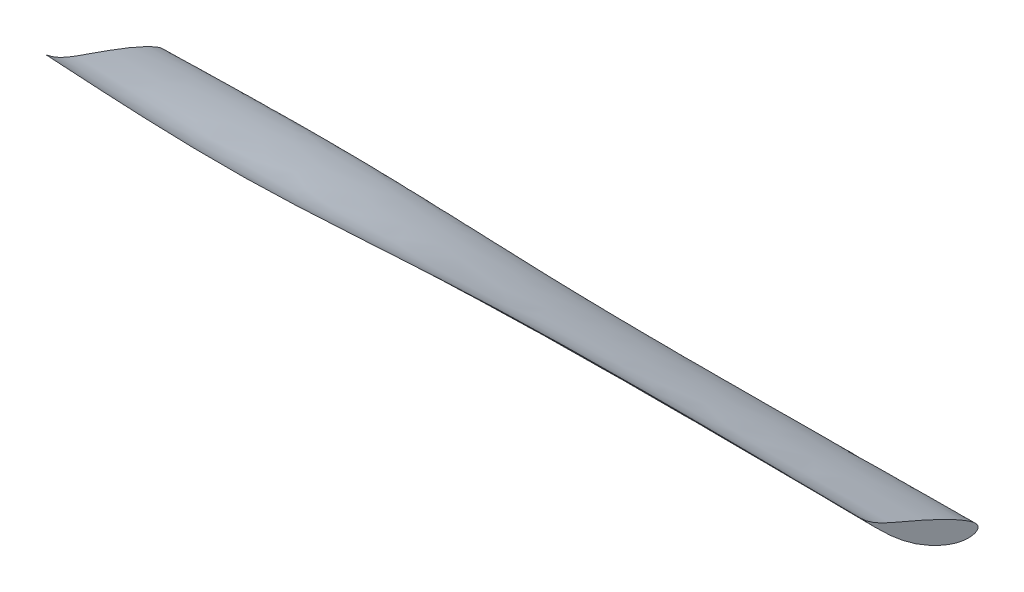
ISO-10303-21;
HEADER;
FILE_DESCRIPTION(('STEP AP214'),'2;1');
FILE_NAME('part.step','',(''),(''),'','','');
FILE_SCHEMA(('AUTOMOTIVE_DESIGN { 1 0 10303 214 1 1 1 1 }'));
ENDSEC;
DATA;
#1=APPLICATION_CONTEXT('core data for automotive mechanical design processes');
#2=APPLICATION_PROTOCOL_DEFINITION('international standard','automotive_design',2000,#1);
#3=PRODUCT_CONTEXT('',#1,'mechanical');
#4=PRODUCT('Part','Part','',(#3));
#5=PRODUCT_RELATED_PRODUCT_CATEGORY('part','',(#4));
#6=PRODUCT_DEFINITION_FORMATION('','',#4);
#7=PRODUCT_DEFINITION_CONTEXT('part definition',#1,'design');
#8=PRODUCT_DEFINITION('design','',#6,#7);
#9=PRODUCT_DEFINITION_SHAPE('','',#8);
#10=(LENGTH_UNIT() NAMED_UNIT(*) SI_UNIT(.MILLI.,.METRE.));
#11=(NAMED_UNIT(*) PLANE_ANGLE_UNIT() SI_UNIT($,.RADIAN.));
#12=(NAMED_UNIT(*) SI_UNIT($,.STERADIAN.) SOLID_ANGLE_UNIT());
#13=UNCERTAINTY_MEASURE_WITH_UNIT(LENGTH_MEASURE(1.E-05),#10,'distance_accuracy_value','');
#14=(GEOMETRIC_REPRESENTATION_CONTEXT(3) GLOBAL_UNCERTAINTY_ASSIGNED_CONTEXT((#13)) GLOBAL_UNIT_ASSIGNED_CONTEXT((#10,
#11,#12)) REPRESENTATION_CONTEXT('',''));
#15=CARTESIAN_POINT('',(0.,0.,0.));
#16=DIRECTION('',(0.,0.,1.));
#17=DIRECTION('',(1.,0.,0.));
#18=AXIS2_PLACEMENT_3D('',#15,#16,#17);
#19=CARTESIAN_POINT('',(301.761653022197,23.5445932351853,31.5919798363942));
#20=DIRECTION('',(1.,0.,0.));
#21=DIRECTION('',(0.,0.,1.));
#22=AXIS2_PLACEMENT_3D('',#19,#20,#21);
#23=PLANE('',#22);
#24=CARTESIAN_POINT('',(301.761653022197,35.4339005781969,54.10357532692));
#25=CARTESIAN_POINT('',(301.761653022197,34.2381881895794,52.8955230255901));
#26=CARTESIAN_POINT('',(301.761653022197,32.1428343468748,50.2360352412443));
#27=CARTESIAN_POINT('',(301.761653022197,29.6938278537414,45.7981714533343));
#28=CARTESIAN_POINT('',(301.761653022197,27.6735843988713,41.1787572420392));
#29=CARTESIAN_POINT('',(301.761653022197,25.7176513120445,36.5225225253925));
#30=CARTESIAN_POINT('',(301.761653022197,23.695720292381,31.894572560708));
#31=CARTESIAN_POINT('',(301.761653022197,21.5984931931603,27.3081732984461));
#32=CARTESIAN_POINT('',(301.761653022197,19.4455955790061,22.7564956841988));
#33=CARTESIAN_POINT('',(301.761653022197,17.5082778691136,19.0387125988831));
#34=CARTESIAN_POINT('',(301.761653022197,15.8538747820841,16.1253914306171));
#35=CARTESIAN_POINT('',(301.761653022197,14.7486241627605,14.3447709325331));
#36=CARTESIAN_POINT('',(301.761653022197,13.798577758102,12.9569555017875));
#37=CARTESIAN_POINT('',(301.761653022197,13.0042141147821,11.9524705075148));
#38=CARTESIAN_POINT('',(301.761653022197,11.9509988926326,10.8600952656026));
#39=CARTESIAN_POINT('',(301.761653022197,10.9287179976586,10.3342016372565));
#40=CARTESIAN_POINT('',(301.761653022197,10.2024209056551,10.6788708378612));
#41=B_SPLINE_CURVE_WITH_KNOTS('',3,(#24,#25,#26,#27,#28,#29,#30,#31,#32,#33,#34,#35,#36,#37,#38,
#39,#40),.UNSPECIFIED.,.F.,.F.,(4,1,1,1,1,1,1,1,1,1,1,1,1,1,4),(0.,0.0994502667406111,
0.197535442889514,0.296052562977772,0.394806356808814,0.493450979662712,0.591940996969297,
0.690286731259081,0.788438582066012,0.837480949450307,0.886562535047494,0.911178481655704,
0.935996245563337,0.961487145328943,1.),.UNSPECIFIED.);
#42=CARTESIAN_POINT('',(301.761653022197,10.2024209056551,10.6788708378612));
#43=VERTEX_POINT('',#42);
#44=CARTESIAN_POINT('',(301.761653022197,35.4339005781969,54.10357532692));
#45=VERTEX_POINT('',#44);
#46=EDGE_CURVE('E40',#43,#45,#41,.F.);
#47=ORIENTED_EDGE('',*,*,#46,.T.);
#48=CARTESIAN_POINT('',(301.761653022197,10.2024209056551,10.6788708378612));
#49=CARTESIAN_POINT('',(301.761653022197,9.53216321875651,11.1904140364192));
#50=CARTESIAN_POINT('',(301.761653022197,9.14745858945485,12.4362131774804));
#51=CARTESIAN_POINT('',(301.761653022197,9.05729615795471,14.1752019618341));
#52=CARTESIAN_POINT('',(301.761653022197,9.15989810619456,15.5901834868764));
#53=CARTESIAN_POINT('',(301.761653022197,9.43036237564233,17.3559755452917));
#54=CARTESIAN_POINT('',(301.761653022197,9.96453582628308,19.4660487541451));
#55=CARTESIAN_POINT('',(301.761653022197,11.0827536415392,22.6853781510137));
#56=CARTESIAN_POINT('',(301.761653022197,12.8232789365591,26.5267046993073));
#57=CARTESIAN_POINT('',(301.761653022197,15.2532400414026,30.9385941988985));
#58=CARTESIAN_POINT('',(301.761653022197,17.9854624447831,35.1779101738743));
#59=CARTESIAN_POINT('',(301.761653022197,21.0567921584213,39.2152051247754));
#60=CARTESIAN_POINT('',(301.761653022197,24.3934392452951,43.0946377459128));
#61=CARTESIAN_POINT('',(301.761653022197,27.9556329108987,46.834343905403));
#62=CARTESIAN_POINT('',(301.761653022197,31.6525993706431,50.4968423811324));
#63=CARTESIAN_POINT('',(301.761653022197,34.1843384422545,52.8862952058577));
#64=CARTESIAN_POINT('',(301.761653022197,35.4339005781969,54.10357532692));
#65=B_SPLINE_CURVE_WITH_KNOTS('',3,(#48,#49,#50,#51,#52,#53,#54,#55,#56,#57,#58,#59,#60,#61,#62,
#63,#64),.UNSPECIFIED.,.F.,.F.,(4,1,1,1,1,1,1,1,1,1,1,1,1,1,4),(0.,0.0439009675766793,
0.0724931974140234,0.0990463982397024,0.124643035702787,0.174283288293371,0.222881713336981,
0.31883035285832,0.41429919096017,0.509891636581509,0.60612378963281,0.703302686626897,
0.801511361886123,0.900533646948853,1.),.UNSPECIFIED.);
#66=EDGE_CURVE('E69',#45,#43,#65,.F.);
#67=ORIENTED_EDGE('',*,*,#66,.T.);
#68=EDGE_LOOP('',(#47,#67));
#69=FACE_BOUND('',#68,.T.);
#70=ADVANCED_FACE('F37',(#69),#23,.T.);
#71=CARTESIAN_POINT('',(0.,23.484223991255,31.7011060039401));
#72=DIRECTION('',(1.,0.,0.));
#73=DIRECTION('',(0.,0.,1.));
#74=AXIS2_PLACEMENT_3D('',#71,#72,#73);
#75=PLANE('',#74);
#76=CARTESIAN_POINT('',(0.,33.4718637070637,54.3097643297301));
#77=CARTESIAN_POINT('',(0.,32.395776073136,53.0586742504488));
#78=CARTESIAN_POINT('',(0.,30.5468507342221,50.3408636441683));
#79=CARTESIAN_POINT('',(0.,28.476047650665,45.8767302196085));
#80=CARTESIAN_POINT('',(0.,26.8328108478623,41.2658512957863));
#81=CARTESIAN_POINT('',(0.,25.2543553945098,36.623674473178));
#82=CARTESIAN_POINT('',(0.,23.6100632017207,32.0044143131714));
#83=CARTESIAN_POINT('',(0.,21.8900292839443,27.4202880068344));
#84=CARTESIAN_POINT('',(0.,20.1137239707885,22.8660129390922));
#85=CARTESIAN_POINT('',(0.,18.4896405150433,19.13397699365));
#86=CARTESIAN_POINT('',(0.,17.084988176991,16.2002424969715));
#87=CARTESIAN_POINT('',(0.,16.1353498503008,14.4007637609852));
#88=CARTESIAN_POINT('',(0.,15.3093801529886,12.9922393722692));
#89=CARTESIAN_POINT('',(0.,14.6081852314093,11.9655257350319));
#90=CARTESIAN_POINT('',(0.,13.662257675184,10.8361332014463));
#91=CARTESIAN_POINT('',(0.,12.7078642109712,10.2574690494851));
#92=CARTESIAN_POINT('',(0.,11.9810754589233,10.542010721781));
#93=B_SPLINE_CURVE_WITH_KNOTS('',3,(#76,#77,#78,#79,#80,#81,#82,#83,#84,#85,#86,#87,#88,#89,#90,
#91,#92),.UNSPECIFIED.,.F.,.F.,(4,1,1,1,1,1,1,1,1,1,1,1,1,1,4),(0.,0.0994502667406111,
0.197535442889514,0.296052562977772,0.394806356808814,0.493450979662712,0.591940996969297,
0.690286731259081,0.788438582066012,0.837480949450307,0.886562535047494,0.911178481655704,
0.935996245563337,0.961487145328943,1.),.UNSPECIFIED.);
#94=CARTESIAN_POINT('',(0.,33.4718637070637,54.3097643297301));
#95=VERTEX_POINT('',#94);
#96=CARTESIAN_POINT('',(0.,11.9810754589233,10.542010721781));
#97=VERTEX_POINT('',#96);
#98=EDGE_CURVE('E11',#95,#97,#93,.T.);
#99=ORIENTED_EDGE('',*,*,#98,.T.);
#100=CARTESIAN_POINT('',(0.,11.9810754589233,10.542010721781));
#101=CARTESIAN_POINT('',(0.,11.297240795926,10.9919689316582));
#102=CARTESIAN_POINT('',(0.,10.8401547295533,12.1724139891022));
#103=CARTESIAN_POINT('',(0.,10.6348750572766,13.8504860760179));
#104=CARTESIAN_POINT('',(0.,10.6382631297944,15.2278368902834));
#105=CARTESIAN_POINT('',(0.,10.7804276026314,16.9563295140538));
#106=CARTESIAN_POINT('',(0.,11.1546378085893,19.0361417787975));
#107=CARTESIAN_POINT('',(0.,12.0192446516231,22.2298709050762));
#108=CARTESIAN_POINT('',(0.,13.4443570594694,26.0682083226455));
#109=CARTESIAN_POINT('',(0.,15.4984768125264,30.5058941070354));
#110=CARTESIAN_POINT('',(0.,17.8570386432198,34.796947575819));
#111=CARTESIAN_POINT('',(0.,20.5577249067278,38.9153485367814));
#112=CARTESIAN_POINT('',(0.,23.5260756529886,42.8988588139013));
#113=CARTESIAN_POINT('',(0.,26.7223431998189,46.76234503904));
#114=CARTESIAN_POINT('',(0.,30.0543735669652,50.5601984947121));
#115=CARTESIAN_POINT('',(0.,32.3442492337358,53.0460845084862));
#116=CARTESIAN_POINT('',(0.,33.4718637070637,54.3097643297301));
#117=B_SPLINE_CURVE_WITH_KNOTS('',3,(#100,#101,#102,#103,#104,#105,#106,#107,#108,#109,#110,
#111,#112,#113,#114,#115,#116),.UNSPECIFIED.,.F.,.F.,(4,1,1,1,1,1,1,1,1,1,1,1,1,1,4),(0.,
0.0439009675766793,0.0724931974140234,0.0990463982397024,0.124643035702787,0.174283288293371,
0.222881713336981,0.31883035285832,0.41429919096017,0.509891636581509,0.60612378963281,
0.703302686626897,0.801511361886123,0.900533646948853,1.),.UNSPECIFIED.);
#118=EDGE_CURVE('E71',#97,#95,#117,.T.);
#119=ORIENTED_EDGE('',*,*,#118,.T.);
#120=EDGE_LOOP('',(#99,#119));
#121=FACE_BOUND('',#120,.T.);
#122=ADVANCED_FACE('F76',(#121),#75,.F.);
#123=CARTESIAN_POINT('',(0.,33.4718637070637,54.3097643297301));
#124=CARTESIAN_POINT('',(25.1501295410293,32.8072218832169,55.1415999108959));
#125=CARTESIAN_POINT('',(75.4596078420801,31.477694599461,56.8055759970798));
#126=CARTESIAN_POINT('',(150.856478264076,35.6917968665905,54.2447361807049));
#127=CARTESIAN_POINT('',(226.323727279319,34.3735008315881,52.076413577077));
#128=CARTESIAN_POINT('',(276.61578764675,35.0804355404218,53.4278576961152));
#129=CARTESIAN_POINT('',(301.761653022197,35.4339005781969,54.10357532692));
#130=CARTESIAN_POINT('',(0.,32.395776073136,53.0586742504488));
#131=CARTESIAN_POINT('',(25.150174230609,31.7774910948192,53.8658320360713));
#132=CARTESIAN_POINT('',(75.4597418674315,30.5406897051055,55.4804433385694));
#133=CARTESIAN_POINT('',(150.856487647617,34.4710954262955,53.0250178805761));
#134=CARTESIAN_POINT('',(226.323820377967,33.2226852029972,50.9598243618174));
#135=CARTESIAN_POINT('',(276.615818679497,33.8996886730896,52.2502929569299));
#136=CARTESIAN_POINT('',(301.761653022197,34.2381881895794,52.8955230255901));
#137=CARTESIAN_POINT('',(0.,30.5468507342221,50.3408636441683));
#138=CARTESIAN_POINT('',(25.1502629963429,30.0199080750922,51.096741147536));
#139=CARTESIAN_POINT('',(75.4600080784537,28.9658152927649,52.6087727968077));
#140=CARTESIAN_POINT('',(150.856506285898,32.3305166758581,50.3559382454705));
#141=CARTESIAN_POINT('',(226.324005297356,31.2187135229882,48.4887967427246));
#142=CARTESIAN_POINT('',(276.615880319024,31.8347954181892,49.6536249531841));
#143=CARTESIAN_POINT('',(301.761653022197,32.1428343468748,50.2360352412443));
#144=CARTESIAN_POINT('',(0.,28.476047650665,45.8767302196085));
#145=CARTESIAN_POINT('',(25.1503960323321,28.0852631727158,46.5506574649339));
#146=CARTESIAN_POINT('',(75.4604070572609,27.3035224048143,47.8987581216417));
#147=CARTESIAN_POINT('',(150.856534219675,29.8181665179494,45.9342669563632));
#148=CARTESIAN_POINT('',(226.324282441845,28.9088823216382,44.3486669099466));
#149=CARTESIAN_POINT('',(276.615972700116,29.4321804862806,45.3150053833477));
#150=CARTESIAN_POINT('',(301.761653022197,29.6938278537414,45.7981714533343));
#151=CARTESIAN_POINT('',(0.,26.8328108478623,41.2658512957863));
#152=CARTESIAN_POINT('',(25.1505287553499,26.577889819095,41.8551259039689));
#153=CARTESIAN_POINT('',(75.460805097458,26.0679115271274,43.0338898203336));
#154=CARTESIAN_POINT('',(150.856562087737,27.7345749162031,41.3483774643656));
#155=CARTESIAN_POINT('',(226.324558934342,27.0274100006166,40.0349706675183));
#156=CARTESIAN_POINT('',(276.616064863879,27.4581938739123,40.7974967164095));
#157=CARTESIAN_POINT('',(301.761653022197,27.6735843988713,41.1787572420392));
#158=CARTESIAN_POINT('',(0.,25.2543553945098,36.623674473178));
#159=CARTESIAN_POINT('',(25.1506617297642,25.1355754193691,37.1276772444217));
#160=CARTESIAN_POINT('',(75.4612038916003,24.8979148870406,38.1358657930484));
#161=CARTESIAN_POINT('',(150.856590008584,25.7150521392037,36.7284839895702));
#162=CARTESIAN_POINT('',(226.324835950555,25.2104501286079,35.6864093910118));
#163=CARTESIAN_POINT('',(276.616157202214,25.5485849896162,36.2438193650293));
#164=CARTESIAN_POINT('',(301.761653022197,25.7176513120445,36.5225225253925));
#165=CARTESIAN_POINT('',(0.,23.6100632017207,32.0044143131714));
#166=CARTESIAN_POINT('',(25.1507946919994,23.6273954977465,32.4236002769637));
#167=CARTESIAN_POINT('',(75.4616026492171,23.6619951508914,33.2621236836661));
#168=CARTESIAN_POINT('',(150.856617926875,23.6296351296986,32.1341887301566));
#169=CARTESIAN_POINT('',(226.325112941397,23.3275285293246,31.3647631931428));
#170=CARTESIAN_POINT('',(276.616249532091,23.5729902409514,31.7179702098314));
#171=CARTESIAN_POINT('',(301.761653022197,23.695720292381,31.894572560708));
#172=CARTESIAN_POINT('',(0.,21.8900292839443,27.4202880068344));
#173=CARTESIAN_POINT('',(25.1509274708664,22.0432798759888,27.7553078559803));
#174=CARTESIAN_POINT('',(75.4620008569076,22.3497517128603,28.4254677454925));
#175=CARTESIAN_POINT('',(150.856645806663,21.469047169434,27.5781955577523));
#176=CARTESIAN_POINT('',(226.325389550241,21.3691379287952,27.0826443050252));
#177=CARTESIAN_POINT('',(276.616341734636,21.5220417724183,27.2329972957793));
#178=CARTESIAN_POINT('',(301.761653022197,21.5984931931603,27.3081732984461));
#179=CARTESIAN_POINT('',(0.,20.1137239707885,22.8660129390922));
#180=CARTESIAN_POINT('',(25.1510600282984,20.4026638412558,23.1174125761227));
#181=CARTESIAN_POINT('',(75.4623984005079,20.9805497664458,23.620300954343));
#182=CARTESIAN_POINT('',(150.856673639956,19.2529084419545,23.0544401906096));
#183=CARTESIAN_POINT('',(226.325665697785,19.3548523158602,22.8335231499637));
#184=CARTESIAN_POINT('',(276.616433783415,19.4153479567879,22.7821713939332));
#185=CARTESIAN_POINT('',(301.761653022197,19.4455955790061,22.7564956841988));
#186=CARTESIAN_POINT('',(0.,18.4896405150433,19.13397699365));
#187=CARTESIAN_POINT('',(25.1511703656322,18.8915438615993,19.3167808924695));
#188=CARTESIAN_POINT('',(75.4627293053863,19.6953863214994,19.6824522875422));
#189=CARTESIAN_POINT('',(150.85669680766,17.2628348385333,19.3538538827248));
#190=CARTESIAN_POINT('',(226.325895555766,17.5328537855784,19.3645578991818));
#191=CARTESIAN_POINT('',(276.616510402407,17.5164698054747,19.1473272244026));
#192=CARTESIAN_POINT('',(301.761653022197,17.5082778691136,19.0387125988831));
#193=CARTESIAN_POINT('',(0.,17.084988176991,16.2002424969715));
#194=CARTESIAN_POINT('',(25.151258565327,17.5772435807156,16.3289650825131));
#195=CARTESIAN_POINT('',(75.4629938188407,18.5618138216369,16.5864537374024));
#196=CARTESIAN_POINT('',(150.856715327089,15.5659418892063,16.4497694712489));
#197=CARTESIAN_POINT('',(226.326079295967,15.9704733652502,16.6478780770652));
#198=CARTESIAN_POINT('',(276.616571648873,15.8927408066519,16.2995528851199));
#199=CARTESIAN_POINT('',(301.761653022197,15.8538747820841,16.1253914306171));
#200=CARTESIAN_POINT('',(0.,16.1353498503008,14.4007637609852));
#201=CARTESIAN_POINT('',(25.1513137204785,16.6841536912539,14.4961746453568));
#202=CARTESIAN_POINT('',(75.4631592307467,17.781835623797,14.6870275060846));
#203=CARTESIAN_POINT('',(150.856726908104,14.4338365871135,14.6718789000898));
#204=CARTESIAN_POINT('',(226.326194196802,14.9226266308645,14.9887030818102));
#205=CARTESIAN_POINT('',(276.616609948984,14.8066247320345,14.5594140444319));
#206=CARTESIAN_POINT('',(301.761653022197,14.7486241627605,14.3447709325331));
#207=CARTESIAN_POINT('',(0.,15.3093801529886,12.9922393722692));
#208=CARTESIAN_POINT('',(25.1513579899141,15.9036403193402,13.0613775067847));
#209=CARTESIAN_POINT('',(75.4632919960737,17.0922468205932,13.1996750919204));
#210=CARTESIAN_POINT('',(150.856736203427,13.4618241579766,13.2834684620636));
#211=CARTESIAN_POINT('',(226.326286420193,14.0184488273131,13.696971063525));
#212=CARTESIAN_POINT('',(276.61664068998,13.8718677942727,13.2036262778983));
#213=CARTESIAN_POINT('',(301.761653022197,13.798577758102,12.9569555017875));
#214=CARTESIAN_POINT('',(0.,14.6081852314093,11.9655257350319));
#215=CARTESIAN_POINT('',(25.1513916584949,15.2371163424784,12.0152223236761));
#216=CARTESIAN_POINT('',(75.4633929691285,16.4950738337329,12.1146295800428));
#217=CARTESIAN_POINT('',(150.856743272872,12.6501564103914,12.2752918265608));
#218=CARTESIAN_POINT('',(226.326356559571,13.2586709595531,12.7639417154428));
#219=CARTESIAN_POINT('',(276.616664069671,13.0890326924333,12.2229597282837));
#220=CARTESIAN_POINT('',(301.761653022197,13.0042141147821,11.9524705075148));
#221=CARTESIAN_POINT('',(0.,13.662257675184,10.8361332014463));
#222=CARTESIAN_POINT('',(25.1514315718752,14.3325539272002,10.8636710359982));
#223=CARTESIAN_POINT('',(75.463512670519,15.6732525854583,10.9187525306391));
#224=CARTESIAN_POINT('',(150.856751653547,11.5748467297918,11.1732077501955));
#225=CARTESIAN_POINT('',(226.3264397083,12.2456660904975,11.7536095922954));
#226=CARTESIAN_POINT('',(276.616691785793,12.0492208627505,11.157932073134));
#227=CARTESIAN_POINT('',(301.761653022197,11.9509988926326,10.8600952656026));
#228=CARTESIAN_POINT('',(0.,12.7078642109712,10.2574690494851));
#229=CARTESIAN_POINT('',(25.1514603329935,13.4087529130871,10.2712141662));
#230=CARTESIAN_POINT('',(75.4635989259506,14.8106446030604,10.2987050749069));
#231=CARTESIAN_POINT('',(150.856757692565,10.5319337556361,10.6272708394146));
#232=CARTESIAN_POINT('',(226.326499624308,11.2500049682347,11.2803122147004));
#233=CARTESIAN_POINT('',(276.616711757708,11.0358131865763,10.6495704517674));
#234=CARTESIAN_POINT('',(301.761653022197,10.9287179976586,10.3342016372565));
#235=CARTESIAN_POINT('',(0.,11.9810754589233,10.542010721781));
#236=CARTESIAN_POINT('',(25.1514776393653,12.7038175079352,10.5498208011367));
#237=CARTESIAN_POINT('',(75.4636508282637,14.149422047491,10.565439402792));
#238=CARTESIAN_POINT('',(150.856761326411,9.77255253207563,10.9456934421059));
#239=CARTESIAN_POINT('',(226.326535677451,10.5293919754492,11.6495376424186));
#240=CARTESIAN_POINT('',(276.61672377537,10.3114107860335,11.0024250256448));
#241=CARTESIAN_POINT('',(301.761653022197,10.2024209056551,10.6788708378612));
#242=B_SPLINE_SURFACE_WITH_KNOTS('',3,3,((#123,#124,#125,#126,#127,#128,#129),(#130,#131,#132,
#133,#134,#135,#136),(#137,#138,#139,#140,#141,#142,#143),(#144,#145,#146,#147,#148,#149,#150),
(#151,#152,#153,#154,#155,#156,#157),(#158,#159,#160,#161,#162,#163,#164),(#165,#166,#167,#168,
#169,#170,#171),(#172,#173,#174,#175,#176,#177,#178),(#179,#180,#181,#182,#183,#184,#185),(#186,
#187,#188,#189,#190,#191,#192),(#193,#194,#195,#196,#197,#198,#199),(#200,#201,#202,#203,#204,
#205,#206),(#207,#208,#209,#210,#211,#212,#213),(#214,#215,#216,#217,#218,#219,#220),(#221,#222,
#223,#224,#225,#226,#227),(#228,#229,#230,#231,#232,#233,#234),(#235,#236,#237,#238,#239,#240,
#241)),.UNSPECIFIED.,.F.,.F.,.F.,(4,1,1,1,1,1,1,1,1,1,1,1,1,1,4),(4,1,1,1,4),(0.,
0.0994502667406111,0.197535442889514,0.296052562977772,0.394806356808814,0.493450979662712,
0.591940996969297,0.690286731259081,0.788438582066012,0.837480949450307,0.886562535047494,
0.911178481655704,0.935996245563337,0.961487145328943,1.),(0.,0.249992169333842,
0.500075977661101,0.750039627093361,1.),.UNSPECIFIED.);
#243=CARTESIAN_POINT('',(0.,33.4718637070637,54.3097643297301));
#244=CARTESIAN_POINT('',(25.1501295410293,32.8072218832169,55.1415999108959));
#245=CARTESIAN_POINT('',(75.4596078420801,31.477694599461,56.8055759970798));
#246=CARTESIAN_POINT('',(150.856478264076,35.6917968665905,54.2447361807049));
#247=CARTESIAN_POINT('',(226.323727279319,34.3735008315881,52.076413577077));
#248=CARTESIAN_POINT('',(276.61578764675,35.0804355404218,53.4278576961152));
#249=CARTESIAN_POINT('',(301.761653022197,35.4339005781969,54.10357532692));
#250=B_SPLINE_CURVE_WITH_KNOTS('',3,(#243,#244,#245,#246,#247,#248,#249),.UNSPECIFIED.,.F.,.F.,
(4,1,1,1,4),(0.,0.249992169333842,0.500075977661101,0.750039627093361,1.),.UNSPECIFIED.);
#251=EDGE_CURVE('E62',#95,#45,#250,.T.);
#252=CARTESIAN_POINT('',(0.,11.9810754589233,10.542010721781));
#253=CARTESIAN_POINT('',(25.1514776393653,12.7038175079352,10.5498208011367));
#254=CARTESIAN_POINT('',(75.4636508282637,14.149422047491,10.565439402792));
#255=CARTESIAN_POINT('',(150.856761326411,9.77255253207563,10.9456934421059));
#256=CARTESIAN_POINT('',(226.326535677451,10.5293919754492,11.6495376424186));
#257=CARTESIAN_POINT('',(276.61672377537,10.3114107860335,11.0024250256448));
#258=CARTESIAN_POINT('',(301.761653022197,10.2024209056551,10.6788708378612));
#259=B_SPLINE_CURVE_WITH_KNOTS('',3,(#252,#253,#254,#255,#256,#257,#258),.UNSPECIFIED.,.F.,.F.,
(4,1,1,1,4),(0.,0.249992169333842,0.500075977661101,0.750039627093361,1.),.UNSPECIFIED.);
#260=EDGE_CURVE('E55',#43,#97,#259,.F.);
#261=ORIENTED_EDGE('',*,*,#98,.F.);
#262=ORIENTED_EDGE('',*,*,#251,.T.);
#263=ORIENTED_EDGE('',*,*,#46,.F.);
#264=ORIENTED_EDGE('',*,*,#260,.T.);
#265=EDGE_LOOP('',(#261,#262,#263,#264));
#266=FACE_BOUND('',#265,.T.);
#267=ADVANCED_FACE('F67',(#266),#242,.F.);
#268=CARTESIAN_POINT('',(0.,11.9810754589233,10.542010721781));
#269=CARTESIAN_POINT('',(25.1514776393653,12.7038175079352,10.5498208011367));
#270=CARTESIAN_POINT('',(75.4636508282637,14.149422047491,10.565439402792));
#271=CARTESIAN_POINT('',(150.856761326411,9.77255253207563,10.9456934421059));
#272=CARTESIAN_POINT('',(226.326535677451,10.5293919754492,11.6495376424186));
#273=CARTESIAN_POINT('',(276.61672377537,10.3114107860335,11.0024250256448));
#274=CARTESIAN_POINT('',(301.761653022197,10.2024209056551,10.6788708378612));
#275=CARTESIAN_POINT('',(0.,11.297240795926,10.9919689316582));
#276=CARTESIAN_POINT('',(25.1514579117582,11.996250203003,11.0173877637249));
#277=CARTESIAN_POINT('',(75.4635916645953,13.3943828735235,11.0682303902781));
#278=CARTESIAN_POINT('',(150.856757184174,9.13293938522365,11.4220976169047));
#279=CARTESIAN_POINT('',(226.326494580319,9.84912114898138,12.1005629533504));
#280=CARTESIAN_POINT('',(276.616710076386,9.63781540052885,11.4937956831359));
#281=CARTESIAN_POINT('',(301.761653022197,9.53216321875651,11.1904140364192));
#282=CARTESIAN_POINT('',(0.,10.8401547295533,12.1724139891022));
#283=CARTESIAN_POINT('',(25.1514253357719,11.5041380423493,12.2238816816891));
#284=CARTESIAN_POINT('',(75.4634939682634,12.8322091764482,12.3268316847532));
#285=CARTESIAN_POINT('',(150.856750344143,8.77385859049885,12.6280410331725));
#286=CARTESIAN_POINT('',(226.326426717066,9.43539337439117,13.2555132916657));
#287=CARTESIAN_POINT('',(276.6166874554,9.24343643173534,12.7093120222659));
#288=CARTESIAN_POINT('',(301.761653022197,9.14745858945485,12.4362131774804));
#289=CARTESIAN_POINT('',(0.,10.6348750572766,13.8504860760179));
#290=CARTESIAN_POINT('',(25.151380827677,11.2523546475892,13.935179384705));
#291=CARTESIAN_POINT('',(75.4633604871902,12.4874060604471,14.1045929453267));
#292=CARTESIAN_POINT('',(150.856740998708,8.71059444372541,14.3267623195674));
#293=CARTESIAN_POINT('',(226.326333996493,9.30152178322231,14.8774694969352));
#294=CARTESIAN_POINT('',(276.616656548678,9.13870434400619,14.4092901173779));
#295=CARTESIAN_POINT('',(301.761653022197,9.05729615795471,14.1752019618341));
#296=CARTESIAN_POINT('',(0.,10.6382631297944,15.2278368902834));
#297=CARTESIAN_POINT('',(25.1513445449278,11.2182807113481,15.3386132129272));
#298=CARTESIAN_POINT('',(75.4632516741682,12.3783982632006,15.5602024816058));
#299=CARTESIAN_POINT('',(150.856733380362,8.83243844224189,15.7149316936863));
#300=CARTESIAN_POINT('',(226.326258411202,9.36714973997579,16.2000533164321));
#301=CARTESIAN_POINT('',(276.616631353691,9.22898168226832,15.7934725418118));
#302=CARTESIAN_POINT('',(301.761653022197,9.15989810619456,15.5901834868764));
#303=CARTESIAN_POINT('',(0.,10.7804276026314,16.9563295140538));
#304=CARTESIAN_POINT('',(25.1512988039104,11.3134860390258,17.0991431776645));
#305=CARTESIAN_POINT('',(75.4631144955246,12.3796729894897,17.3848190220934));
#306=CARTESIAN_POINT('',(150.856723776048,9.12554962537821,17.4519922524038));
#307=CARTESIAN_POINT('',(226.326163122168,9.59019602288135,17.8518960716371));
#308=CARTESIAN_POINT('',(276.616599590818,9.48364002526433,17.5212816651194));
#309=CARTESIAN_POINT('',(301.761653022197,9.43036237564233,17.3559755452917));
#310=CARTESIAN_POINT('',(0.,11.1546378085893,19.0361417787975));
#311=CARTESIAN_POINT('',(25.1512431565163,11.6308899694924,19.2166716020149));
#312=CARTESIAN_POINT('',(75.4629476073685,12.5834495100534,19.5777937736236));
#313=CARTESIAN_POINT('',(150.856712091677,9.68533645459287,19.5346691982537));
#314=CARTESIAN_POINT('',(226.326047195879,10.0657128507156,19.8271199420494));
#315=CARTESIAN_POINT('',(276.616560948891,9.99826135373381,19.5864052908948));
#316=CARTESIAN_POINT('',(301.761653022197,9.96453582628308,19.4660487541451));
#317=CARTESIAN_POINT('',(0.,12.0192446516231,22.2298709050762));
#318=CARTESIAN_POINT('',(25.1511558953166,12.4066492786468,22.4677228317714));
#319=CARTESIAN_POINT('',(75.4626859084885,13.1814905356842,22.9435105088545));
#320=CARTESIAN_POINT('',(150.856693769305,10.8423333929799,22.7219635731547));
#321=CARTESIAN_POINT('',(226.325865410779,11.0912579956943,22.8404530363583));
#322=CARTESIAN_POINT('',(276.616500354122,11.0855884138713,22.7370695536018));
#323=CARTESIAN_POINT('',(301.761653022197,11.0827536415392,22.6853781510137));
#324=CARTESIAN_POINT('',(0.,13.4443570594694,26.0682083226455));
#325=CARTESIAN_POINT('',(25.1510480403036,13.7221083921928,26.3745228180031));
#326=CARTESIAN_POINT('',(75.4623624481624,14.2776144254409,26.9872610821822));
#327=CARTESIAN_POINT('',(150.856671122818,12.6298152143494,26.5380201693059));
#328=CARTESIAN_POINT('',(226.325640724041,12.716752456912,26.434329862274));
#329=CARTESIAN_POINT('',(276.61642545887,12.7877702651614,26.4959132215029));
#330=CARTESIAN_POINT('',(301.761653022197,12.8232789365591,26.5267046993073));
#331=CARTESIAN_POINT('',(0.,15.4984768125264,30.5058941070354));
#332=CARTESIAN_POINT('',(25.1509190677703,15.6449945769688,30.8916283507052));
#333=CARTESIAN_POINT('',(75.4619756557776,15.9379991912631,31.6632356470629));
#334=CARTESIAN_POINT('',(150.856644042252,15.116590642896,30.9343762569383));
#335=CARTESIAN_POINT('',(226.325372044664,15.0094921489695,30.5576616474976));
#336=CARTESIAN_POINT('',(276.616335899469,15.1719910989335,30.8116172365772));
#337=CARTESIAN_POINT('',(301.761653022197,15.2532400414026,30.9385941988985));
#338=CARTESIAN_POINT('',(0.,17.8570386432198,34.796947575819));
#339=CARTESIAN_POINT('',(25.1507899678356,17.8719805410207,35.2600204437783));
#340=CARTESIAN_POINT('',(75.4615884813124,17.90179902782,36.1863337618146));
#341=CARTESIAN_POINT('',(150.856616934935,17.906959421453,35.1711004082479));
#342=CARTESIAN_POINT('',(226.32510309988,17.6049955019334,34.5146127987241));
#343=CARTESIAN_POINT('',(276.6162462516,17.858640684634,34.9568120148891));
#344=CARTESIAN_POINT('',(301.761653022197,17.9854624447831,35.1779101738743));
#345=CARTESIAN_POINT('',(0.,20.5577249067278,38.9153485367814));
#346=CARTESIAN_POINT('',(25.1506600994584,20.4398709994437,39.4537987349303));
#347=CARTESIAN_POINT('',(75.4611990022657,20.2040631170343,40.5308947700182));
#348=CARTESIAN_POINT('',(150.856589666266,21.0394020596869,39.2203173435487));
#349=CARTESIAN_POINT('',(226.324832554254,20.5401024856486,38.2751262234526));
#350=CARTESIAN_POINT('',(276.616156070118,20.884563020034,38.9018468601867));
#351=CARTESIAN_POINT('',(301.761653022197,21.0567921584213,39.2152051247754));
#352=CARTESIAN_POINT('',(0.,23.5260756529886,42.8988588139013));
#353=CARTESIAN_POINT('',(25.1505290554363,23.2737486104272,43.5115156413309));
#354=CARTESIAN_POINT('',(75.4608059974257,22.7689592095784,44.7370525663662));
#355=CARTESIAN_POINT('',(150.856562150746,24.4405662924625,43.1228977883338));
#356=CARTESIAN_POINT('',(226.32455955949,23.7407190525903,41.8808302289718));
#357=CARTESIAN_POINT('',(276.616065072261,24.1758667983864,42.6900370081256));
#358=CARTESIAN_POINT('',(301.761653022197,24.3934392452951,43.0946377459128));
#359=CARTESIAN_POINT('',(0.,26.7223431998189,46.76234503904));
#360=CARTESIAN_POINT('',(25.1503967576233,26.333765273407,47.4483596464146));
#361=CARTESIAN_POINT('',(75.4604092324305,25.5564383396917,48.8206394556762));
#362=CARTESIAN_POINT('',(150.856534371966,28.0708411599706,46.8953258836179));
#363=CARTESIAN_POINT('',(226.324283952793,27.1670539643205,45.3488647531586));
#364=CARTESIAN_POINT('',(276.615973203763,27.6927744105715,46.3391863515264));
#365=CARTESIAN_POINT('',(301.761653022197,27.9556329108987,46.834343905403));
#366=CARTESIAN_POINT('',(0.,30.0543735669652,50.5601984947121));
#367=CARTESIAN_POINT('',(25.1502634319052,29.528166719468,51.3192564402399));
#368=CARTESIAN_POINT('',(75.4600093847176,28.475545783446,52.8376501382505));
#369=CARTESIAN_POINT('',(150.856506377354,31.8383342183656,50.5961067456516));
#370=CARTESIAN_POINT('',(226.324006204732,30.7280642343537,48.7402336933557));
#371=CARTESIAN_POINT('',(276.615880621481,31.3444223384267,49.9113087103005));
#372=CARTESIAN_POINT('',(301.761653022197,31.6525993706431,50.4968423811324));
#373=CARTESIAN_POINT('',(0.,32.3442492337358,53.0460845084862));
#374=CARTESIAN_POINT('',(25.1501742378376,31.7257797965634,53.8535178737252));
#375=CARTESIAN_POINT('',(75.4597418891104,30.488609420747,55.4686804364511));
#376=CARTESIAN_POINT('',(150.856487649135,34.4183933333511,53.0141108139822));
#377=CARTESIAN_POINT('',(226.323820393025,33.1694185186456,50.9497727255412));
#378=CARTESIAN_POINT('',(276.615818684516,33.8460332792399,52.2407905328827));
#379=CARTESIAN_POINT('',(301.761653022197,34.1843384422545,52.8862952058577));
#380=CARTESIAN_POINT('',(0.,33.4718637070637,54.3097643297301));
#381=CARTESIAN_POINT('',(25.1501295410293,32.8072218832169,55.1415999108959));
#382=CARTESIAN_POINT('',(75.4596078420801,31.477694599461,56.8055759970798));
#383=CARTESIAN_POINT('',(150.856478264076,35.6917968665905,54.2447361807049));
#384=CARTESIAN_POINT('',(226.323727279319,34.3735008315881,52.076413577077));
#385=CARTESIAN_POINT('',(276.61578764675,35.0804355404218,53.4278576961152));
#386=CARTESIAN_POINT('',(301.761653022197,35.4339005781969,54.10357532692));
#387=B_SPLINE_SURFACE_WITH_KNOTS('',3,3,((#268,#269,#270,#271,#272,#273,#274),(#275,#276,#277,
#278,#279,#280,#281),(#282,#283,#284,#285,#286,#287,#288),(#289,#290,#291,#292,#293,#294,#295),
(#296,#297,#298,#299,#300,#301,#302),(#303,#304,#305,#306,#307,#308,#309),(#310,#311,#312,#313,
#314,#315,#316),(#317,#318,#319,#320,#321,#322,#323),(#324,#325,#326,#327,#328,#329,#330),(#331,
#332,#333,#334,#335,#336,#337),(#338,#339,#340,#341,#342,#343,#344),(#345,#346,#347,#348,#349,
#350,#351),(#352,#353,#354,#355,#356,#357,#358),(#359,#360,#361,#362,#363,#364,#365),(#366,#367,
#368,#369,#370,#371,#372),(#373,#374,#375,#376,#377,#378,#379),(#380,#381,#382,#383,#384,#385,
#386)),.UNSPECIFIED.,.F.,.F.,.F.,(4,1,1,1,1,1,1,1,1,1,1,1,1,1,4),(4,1,1,1,4),(0.,
0.0439009675766793,0.0724931974140234,0.0990463982397024,0.124643035702787,0.174283288293371,
0.222881713336981,0.31883035285832,0.41429919096017,0.509891636581509,0.60612378963281,
0.703302686626897,0.801511361886123,0.900533646948853,1.),(0.,0.249992169333842,
0.500075977661101,0.750039627093361,1.),.UNSPECIFIED.);
#388=ORIENTED_EDGE('',*,*,#118,.F.);
#389=ORIENTED_EDGE('',*,*,#260,.F.);
#390=ORIENTED_EDGE('',*,*,#66,.F.);
#391=ORIENTED_EDGE('',*,*,#251,.F.);
#392=EDGE_LOOP('',(#388,#389,#390,#391));
#393=FACE_BOUND('',#392,.T.);
#394=ADVANCED_FACE('F72',(#393),#387,.F.);
#395=CLOSED_SHELL('',(#70,#122,#267,#394));
#396=MANIFOLD_SOLID_BREP('B2',#395);
#397=ADVANCED_BREP_SHAPE_REPRESENTATION('',(#18,#396),#14);
#398=SHAPE_DEFINITION_REPRESENTATION(#9,#397);
ENDSEC;
END-ISO-10303-21;
